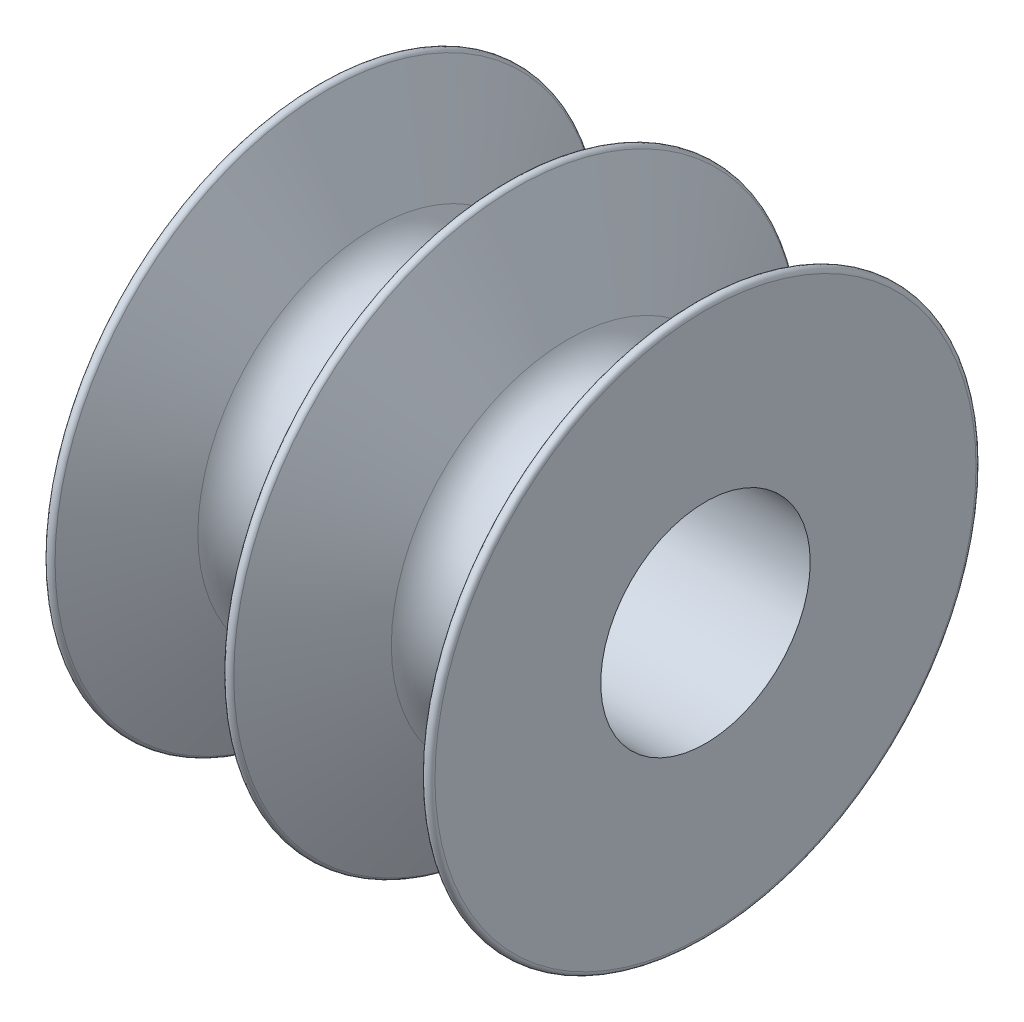
ISO-10303-21;
HEADER;
FILE_DESCRIPTION(('STEP AP214'),'2;1');
FILE_NAME('part.step','',(''),(''),'','','');
FILE_SCHEMA(('AUTOMOTIVE_DESIGN { 1 0 10303 214 1 1 1 1 }'));
ENDSEC;
DATA;
#1=APPLICATION_CONTEXT('core data for automotive mechanical design processes');
#2=APPLICATION_PROTOCOL_DEFINITION('international standard','automotive_design',2000,#1);
#3=PRODUCT_CONTEXT('',#1,'mechanical');
#4=PRODUCT('Part','Part','',(#3));
#5=PRODUCT_RELATED_PRODUCT_CATEGORY('part','',(#4));
#6=PRODUCT_DEFINITION_FORMATION('','',#4);
#7=PRODUCT_DEFINITION_CONTEXT('part definition',#1,'design');
#8=PRODUCT_DEFINITION('design','',#6,#7);
#9=PRODUCT_DEFINITION_SHAPE('','',#8);
#10=(LENGTH_UNIT() NAMED_UNIT(*) SI_UNIT(.MILLI.,.METRE.));
#11=(NAMED_UNIT(*) PLANE_ANGLE_UNIT() SI_UNIT($,.RADIAN.));
#12=(NAMED_UNIT(*) SI_UNIT($,.STERADIAN.) SOLID_ANGLE_UNIT());
#13=UNCERTAINTY_MEASURE_WITH_UNIT(LENGTH_MEASURE(1.E-05),#10,'distance_accuracy_value','');
#14=(GEOMETRIC_REPRESENTATION_CONTEXT(3) GLOBAL_UNCERTAINTY_ASSIGNED_CONTEXT((#13)) GLOBAL_UNIT_ASSIGNED_CONTEXT((#10,
#11,#12)) REPRESENTATION_CONTEXT('',''));
#15=CARTESIAN_POINT('',(0.,0.,0.));
#16=DIRECTION('',(0.,0.,1.));
#17=DIRECTION('',(1.,0.,0.));
#18=AXIS2_PLACEMENT_3D('',#15,#16,#17);
#19=CARTESIAN_POINT('',(0.,0.,0.));
#20=DIRECTION('',(-1.,0.,0.));
#21=DIRECTION('',(0.,0.,1.));
#22=AXIS2_PLACEMENT_3D('',#19,#20,#21);
#23=TOROIDAL_SURFACE('',#22,5.159375,1.190625);
#24=CARTESIAN_POINT('',(1.07022471910112,0.,0.));
#25=DIRECTION('',(-1.,0.,0.));
#26=DIRECTION('',(0.,0.,1.));
#27=AXIS2_PLACEMENT_3D('',#24,#25,#26);
#28=CIRCLE('',#27,4.6376404494382);
#29=CARTESIAN_POINT('',(1.07022471910112,0.,4.6376404494382));
#30=VERTEX_POINT('',#29);
#31=EDGE_CURVE('E65',#30,#30,#28,.T.);
#32=ORIENTED_EDGE('',*,*,#31,.T.);
#33=EDGE_LOOP('',(#32));
#34=FACE_BOUND('',#33,.T.);
#35=CARTESIAN_POINT('',(-1.07022471910112,0.,0.));
#36=DIRECTION('',(-1.,0.,0.));
#37=DIRECTION('',(0.,0.,1.));
#38=AXIS2_PLACEMENT_3D('',#35,#36,#37);
#39=CIRCLE('',#38,4.6376404494382);
#40=CARTESIAN_POINT('',(-1.07022471910112,0.,4.6376404494382));
#41=VERTEX_POINT('',#40);
#42=EDGE_CURVE('E62',#41,#41,#39,.T.);
#43=ORIENTED_EDGE('',*,*,#42,.F.);
#44=EDGE_LOOP('',(#43));
#45=FACE_BOUND('',#44,.T.);
#46=ADVANCED_FACE('F36',(#34,#45),#23,.F.);
#47=CARTESIAN_POINT('',(-2.53999999999999,0.,0.));
#48=DIRECTION('',(-1.,0.,0.));
#49=DIRECTION('',(0.,0.,1.));
#50=AXIS2_PLACEMENT_3D('',#47,#48,#49);
#51=CONICAL_SURFACE('',#50,7.6525641025641,1.11719863068713);
#52=CARTESIAN_POINT('',(-2.29884269662921,0.,0.));
#53=DIRECTION('',(-1.,0.,0.));
#54=DIRECTION('',(0.,0.,1.));
#55=AXIS2_PLACEMENT_3D('',#52,#53,#54);
#56=CIRCLE('',#55,7.15788245462404);
#57=CARTESIAN_POINT('',(-2.29884269662921,0.,7.15788245462404));
#58=VERTEX_POINT('',#57);
#59=EDGE_CURVE('E47',#58,#58,#56,.F.);
#60=ORIENTED_EDGE('',*,*,#59,.T.);
#61=EDGE_LOOP('',(#60));
#62=FACE_BOUND('',#61,.T.);
#63=ORIENTED_EDGE('',*,*,#42,.T.);
#64=EDGE_LOOP('',(#63));
#65=FACE_BOUND('',#64,.T.);
#66=ADVANCED_FACE('F121',(#62,#65),#51,.T.);
#67=CARTESIAN_POINT('',(-2.54,0.,0.));
#68=DIRECTION('',(1.,0.,0.));
#69=DIRECTION('',(0.,0.,-1.));
#70=AXIS2_PLACEMENT_3D('',#67,#68,#69);
#71=PLANE('',#70);
#72=CARTESIAN_POINT('',(-2.54,0.,0.));
#73=DIRECTION('',(1.,0.,0.));
#74=DIRECTION('',(0.,0.,-1.));
#75=AXIS2_PLACEMENT_3D('',#72,#73,#74);
#76=CIRCLE('',#75,2.7499945);
#77=CARTESIAN_POINT('',(-2.54,0.,-2.7499945));
#78=VERTEX_POINT('',#77);
#79=EDGE_CURVE('E74',#78,#78,#76,.T.);
#80=ORIENTED_EDGE('',*,*,#79,.T.);
#81=EDGE_LOOP('',(#80));
#82=FACE_BOUND('',#81,.T.);
#83=CARTESIAN_POINT('',(-2.54,0.,0.));
#84=DIRECTION('',(1.,0.,0.));
#85=DIRECTION('',(0.,0.,-1.));
#86=AXIS2_PLACEMENT_3D('',#83,#84,#85);
#87=CIRCLE('',#86,7.10223076923079);
#88=CARTESIAN_POINT('',(-2.54,0.,-7.10223076923079));
#89=VERTEX_POINT('',#88);
#90=EDGE_CURVE('E51',#89,#89,#87,.F.);
#91=ORIENTED_EDGE('',*,*,#90,.T.);
#92=EDGE_LOOP('',(#91));
#93=FACE_BOUND('',#92,.T.);
#94=ADVANCED_FACE('F81',(#82,#93),#71,.F.);
#95=CARTESIAN_POINT('',(2.53999999999999,0.,0.));
#96=DIRECTION('',(1.,0.,0.));
#97=DIRECTION('',(0.,0.,-1.));
#98=AXIS2_PLACEMENT_3D('',#95,#96,#97);
#99=CONICAL_SURFACE('',#98,7.6525641025641,1.11719863068713);
#100=CARTESIAN_POINT('',(2.42584269662922,0.,0.));
#101=DIRECTION('',(-1.,0.,0.));
#102=DIRECTION('',(0.,0.,1.));
#103=AXIS2_PLACEMENT_3D('',#100,#101,#102);
#104=CIRCLE('',#103,7.41839527513688);
#105=CARTESIAN_POINT('',(2.42584269662922,0.,7.41839527513688));
#106=VERTEX_POINT('',#105);
#107=EDGE_CURVE('E43',#106,#106,#104,.T.);
#108=ORIENTED_EDGE('',*,*,#107,.T.);
#109=EDGE_LOOP('',(#108));
#110=FACE_BOUND('',#109,.T.);
#111=ORIENTED_EDGE('',*,*,#31,.F.);
#112=EDGE_LOOP('',(#111));
#113=FACE_BOUND('',#112,.T.);
#114=ADVANCED_FACE('F112',(#110,#113),#99,.T.);
#115=CARTESIAN_POINT('',(5.08,0.,0.));
#116=DIRECTION('',(1.,0.,0.));
#117=DIRECTION('',(0.,0.,1.));
#118=AXIS2_PLACEMENT_3D('',#115,#116,#117);
#119=TOROIDAL_SURFACE('',#118,5.159375,1.190625);
#120=CARTESIAN_POINT('',(4.00977528089888,0.,0.));
#121=DIRECTION('',(-1.,0.,0.));
#122=DIRECTION('',(0.,0.,1.));
#123=AXIS2_PLACEMENT_3D('',#120,#121,#122);
#124=CIRCLE('',#123,4.6376404494382);
#125=CARTESIAN_POINT('',(4.00977528089888,0.,4.6376404494382));
#126=VERTEX_POINT('',#125);
#127=EDGE_CURVE('E71',#126,#126,#124,.T.);
#128=ORIENTED_EDGE('',*,*,#127,.F.);
#129=EDGE_LOOP('',(#128));
#130=FACE_BOUND('',#129,.T.);
#131=CARTESIAN_POINT('',(6.15022471910112,0.,0.));
#132=DIRECTION('',(-1.,0.,0.));
#133=DIRECTION('',(0.,0.,1.));
#134=AXIS2_PLACEMENT_3D('',#131,#132,#133);
#135=CIRCLE('',#134,4.6376404494382);
#136=CARTESIAN_POINT('',(6.15022471910112,0.,4.6376404494382));
#137=VERTEX_POINT('',#136);
#138=EDGE_CURVE('E68',#137,#137,#135,.T.);
#139=ORIENTED_EDGE('',*,*,#138,.T.);
#140=EDGE_LOOP('',(#139));
#141=FACE_BOUND('',#140,.T.);
#142=ADVANCED_FACE('F107',(#130,#141),#119,.F.);
#143=CARTESIAN_POINT('',(7.61999999999999,0.,0.));
#144=DIRECTION('',(1.,0.,0.));
#145=DIRECTION('',(0.,0.,1.));
#146=AXIS2_PLACEMENT_3D('',#143,#144,#145);
#147=CONICAL_SURFACE('',#146,7.6525641025641,1.11719863068713);
#148=CARTESIAN_POINT('',(7.37884269662922,0.,0.));
#149=DIRECTION('',(1.,0.,0.));
#150=DIRECTION('',(0.,0.,-1.));
#151=AXIS2_PLACEMENT_3D('',#148,#149,#150);
#152=CIRCLE('',#151,7.15788245462404);
#153=CARTESIAN_POINT('',(7.37884269662922,0.,-7.15788245462404));
#154=VERTEX_POINT('',#153);
#155=EDGE_CURVE('E59',#154,#154,#152,.F.);
#156=ORIENTED_EDGE('',*,*,#155,.T.);
#157=EDGE_LOOP('',(#156));
#158=FACE_BOUND('',#157,.T.);
#159=ORIENTED_EDGE('',*,*,#138,.F.);
#160=EDGE_LOOP('',(#159));
#161=FACE_BOUND('',#160,.T.);
#162=ADVANCED_FACE('F94',(#158,#161),#147,.T.);
#163=CARTESIAN_POINT('',(7.62,0.,0.));
#164=DIRECTION('',(-1.,0.,0.));
#165=DIRECTION('',(0.,0.,-1.));
#166=AXIS2_PLACEMENT_3D('',#163,#164,#165);
#167=PLANE('',#166);
#168=CARTESIAN_POINT('',(7.62,0.,0.));
#169=DIRECTION('',(1.,0.,0.));
#170=DIRECTION('',(0.,0.,-1.));
#171=AXIS2_PLACEMENT_3D('',#168,#169,#170);
#172=CIRCLE('',#171,2.7499945);
#173=CARTESIAN_POINT('',(7.62,0.,-2.7499945));
#174=VERTEX_POINT('',#173);
#175=EDGE_CURVE('E75',#174,#174,#172,.T.);
#176=ORIENTED_EDGE('',*,*,#175,.F.);
#177=EDGE_LOOP('',(#176));
#178=FACE_BOUND('',#177,.T.);
#179=CARTESIAN_POINT('',(7.62,0.,0.));
#180=DIRECTION('',(-1.,0.,0.));
#181=DIRECTION('',(0.,0.,1.));
#182=AXIS2_PLACEMENT_3D('',#179,#180,#181);
#183=CIRCLE('',#182,7.10223076923079);
#184=CARTESIAN_POINT('',(7.62,0.,7.10223076923079));
#185=VERTEX_POINT('',#184);
#186=EDGE_CURVE('E56',#185,#185,#183,.F.);
#187=ORIENTED_EDGE('',*,*,#186,.T.);
#188=EDGE_LOOP('',(#187));
#189=FACE_BOUND('',#188,.T.);
#190=ADVANCED_FACE('F90',(#178,#189),#167,.F.);
#191=CARTESIAN_POINT('',(2.54000000000002,0.,0.));
#192=DIRECTION('',(-1.,0.,0.));
#193=DIRECTION('',(0.,0.,-1.));
#194=AXIS2_PLACEMENT_3D('',#191,#192,#193);
#195=CONICAL_SURFACE('',#194,7.6525641025641,1.11719863068713);
#196=CARTESIAN_POINT('',(2.65415730337079,0.,0.));
#197=DIRECTION('',(1.,0.,0.));
#198=DIRECTION('',(0.,0.,-1.));
#199=AXIS2_PLACEMENT_3D('',#196,#197,#198);
#200=CIRCLE('',#199,7.41839527513688);
#201=CARTESIAN_POINT('',(2.65415730337079,0.,-7.41839527513688));
#202=VERTEX_POINT('',#201);
#203=EDGE_CURVE('E10',#202,#202,#200,.T.);
#204=ORIENTED_EDGE('',*,*,#203,.T.);
#205=EDGE_LOOP('',(#204));
#206=FACE_BOUND('',#205,.T.);
#207=ORIENTED_EDGE('',*,*,#127,.T.);
#208=EDGE_LOOP('',(#207));
#209=FACE_BOUND('',#208,.T.);
#210=ADVANCED_FACE('F93',(#206,#209),#195,.T.);
#211=CARTESIAN_POINT('',(7.493,0.,0.));
#212=DIRECTION('',(-1.,0.,0.));
#213=DIRECTION('',(0.,0.,1.));
#214=AXIS2_PLACEMENT_3D('',#211,#212,#213);
#215=TOROIDAL_SURFACE('',#214,7.10223076923079,0.127);
#216=ORIENTED_EDGE('',*,*,#186,.F.);
#217=EDGE_LOOP('',(#216));
#218=FACE_BOUND('',#217,.T.);
#219=ORIENTED_EDGE('',*,*,#155,.F.);
#220=EDGE_LOOP('',(#219));
#221=FACE_BOUND('',#220,.T.);
#222=ADVANCED_FACE('F98',(#218,#221),#215,.T.);
#223=CARTESIAN_POINT('',(-2.413,0.,0.));
#224=DIRECTION('',(1.,0.,0.));
#225=DIRECTION('',(0.,0.,-1.));
#226=AXIS2_PLACEMENT_3D('',#223,#224,#225);
#227=TOROIDAL_SURFACE('',#226,7.10223076923079,0.127);
#228=ORIENTED_EDGE('',*,*,#59,.F.);
#229=EDGE_LOOP('',(#228));
#230=FACE_BOUND('',#229,.T.);
#231=ORIENTED_EDGE('',*,*,#90,.F.);
#232=EDGE_LOOP('',(#231));
#233=FACE_BOUND('',#232,.T.);
#234=ADVANCED_FACE('F101',(#230,#233),#227,.T.);
#235=CARTESIAN_POINT('',(2.54,0.,0.));
#236=DIRECTION('',(1.,0.,0.));
#237=DIRECTION('',(0.,0.,-1.));
#238=AXIS2_PLACEMENT_3D('',#235,#236,#237);
#239=TOROIDAL_SURFACE('',#238,7.36274358974362,0.127);
#240=ORIENTED_EDGE('',*,*,#203,.F.);
#241=EDGE_LOOP('',(#240));
#242=FACE_BOUND('',#241,.T.);
#243=ORIENTED_EDGE('',*,*,#107,.F.);
#244=EDGE_LOOP('',(#243));
#245=FACE_BOUND('',#244,.T.);
#246=ADVANCED_FACE('F38',(#242,#245),#239,.T.);
#247=CARTESIAN_POINT('',(-2.54,0.,0.));
#248=DIRECTION('',(1.,0.,0.));
#249=DIRECTION('',(0.,0.,-1.));
#250=AXIS2_PLACEMENT_3D('',#247,#248,#249);
#251=CYLINDRICAL_SURFACE('',#250,2.7499945);
#252=ORIENTED_EDGE('',*,*,#79,.F.);
#253=EDGE_LOOP('',(#252));
#254=FACE_BOUND('',#253,.T.);
#255=ORIENTED_EDGE('',*,*,#175,.T.);
#256=EDGE_LOOP('',(#255));
#257=FACE_BOUND('',#256,.T.);
#258=ADVANCED_FACE('F84',(#254,#257),#251,.F.);
#259=CLOSED_SHELL('',(#46,#66,#94,#114,#142,#162,#190,#210,#222,#234,#246,#258));
#260=MANIFOLD_SOLID_BREP('B2',#259);
#261=ADVANCED_BREP_SHAPE_REPRESENTATION('',(#18,#260),#14);
#262=SHAPE_DEFINITION_REPRESENTATION(#9,#261);
ENDSEC;
END-ISO-10303-21;
